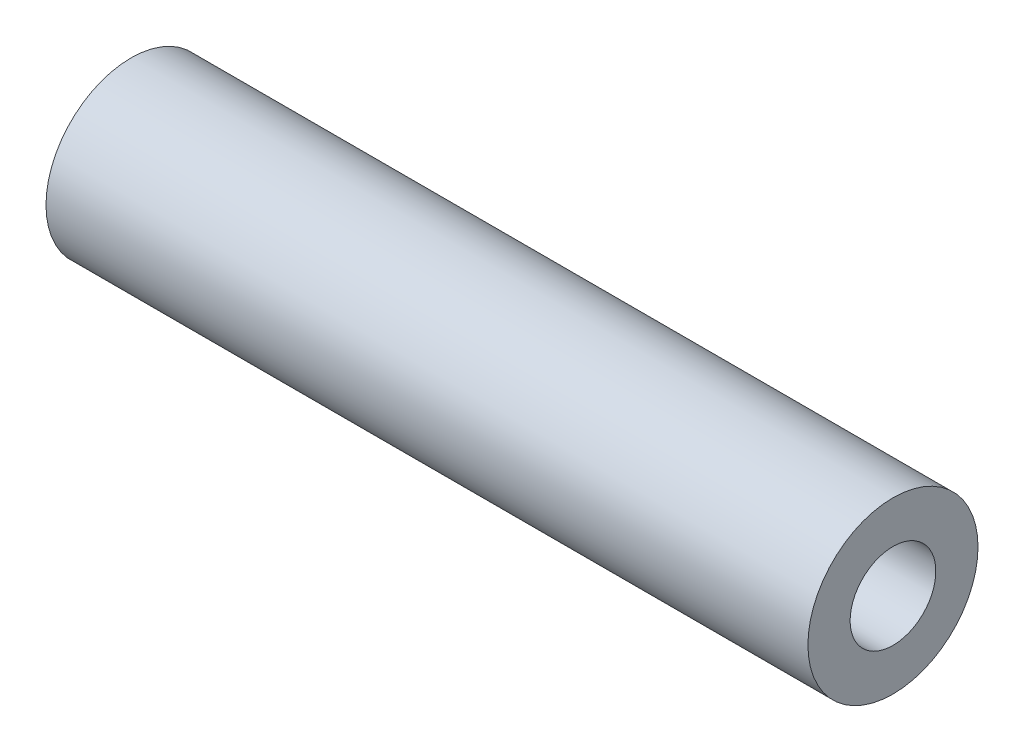
ISO-10303-21;
HEADER;
FILE_DESCRIPTION(('STEP AP214'),'2;1');
FILE_NAME('part.step','',(''),(''),'','','');
FILE_SCHEMA(('AUTOMOTIVE_DESIGN { 1 0 10303 214 1 1 1 1 }'));
ENDSEC;
DATA;
#1=APPLICATION_CONTEXT('core data for automotive mechanical design processes');
#2=APPLICATION_PROTOCOL_DEFINITION('international standard','automotive_design',2000,#1);
#3=PRODUCT_CONTEXT('',#1,'mechanical');
#4=PRODUCT('Part','Part','',(#3));
#5=PRODUCT_RELATED_PRODUCT_CATEGORY('part','',(#4));
#6=PRODUCT_DEFINITION_FORMATION('','',#4);
#7=PRODUCT_DEFINITION_CONTEXT('part definition',#1,'design');
#8=PRODUCT_DEFINITION('design','',#6,#7);
#9=PRODUCT_DEFINITION_SHAPE('','',#8);
#10=(LENGTH_UNIT() NAMED_UNIT(*) SI_UNIT(.MILLI.,.METRE.));
#11=(NAMED_UNIT(*) PLANE_ANGLE_UNIT() SI_UNIT($,.RADIAN.));
#12=(NAMED_UNIT(*) SI_UNIT($,.STERADIAN.) SOLID_ANGLE_UNIT());
#13=UNCERTAINTY_MEASURE_WITH_UNIT(LENGTH_MEASURE(1.E-05),#10,'distance_accuracy_value','');
#14=(GEOMETRIC_REPRESENTATION_CONTEXT(3) GLOBAL_UNCERTAINTY_ASSIGNED_CONTEXT((#13)) GLOBAL_UNIT_ASSIGNED_CONTEXT((#10,
#11,#12)) REPRESENTATION_CONTEXT('',''));
#15=CARTESIAN_POINT('',(0.,0.,0.));
#16=DIRECTION('',(0.,0.,1.));
#17=DIRECTION('',(1.,0.,0.));
#18=AXIS2_PLACEMENT_3D('',#15,#16,#17);
#19=CARTESIAN_POINT('',(28.448,0.,0.));
#20=DIRECTION('',(1.,0.,0.));
#21=DIRECTION('',(0.,0.,1.));
#22=AXIS2_PLACEMENT_3D('',#19,#20,#21);
#23=PLANE('',#22);
#24=CARTESIAN_POINT('',(28.448,0.,0.));
#25=DIRECTION('',(-1.,0.,0.));
#26=DIRECTION('',(0.,0.,1.));
#27=AXIS2_PLACEMENT_3D('',#24,#25,#26);
#28=CIRCLE('',#27,3.175);
#29=CARTESIAN_POINT('',(28.448,0.,3.175));
#30=VERTEX_POINT('',#29);
#31=EDGE_CURVE('E10',#30,#30,#28,.T.);
#32=ORIENTED_EDGE('',*,*,#31,.F.);
#33=EDGE_LOOP('',(#32));
#34=FACE_BOUND('',#33,.T.);
#35=CARTESIAN_POINT('',(28.448,0.,0.));
#36=DIRECTION('',(-1.,0.,0.));
#37=DIRECTION('',(0.,0.,1.));
#38=AXIS2_PLACEMENT_3D('',#35,#36,#37);
#39=CIRCLE('',#38,1.6002);
#40=CARTESIAN_POINT('',(28.448,0.,1.6002));
#41=VERTEX_POINT('',#40);
#42=EDGE_CURVE('E46',#41,#41,#39,.T.);
#43=ORIENTED_EDGE('',*,*,#42,.T.);
#44=EDGE_LOOP('',(#43));
#45=FACE_BOUND('',#44,.T.);
#46=ADVANCED_FACE('F35',(#34,#45),#23,.T.);
#47=CARTESIAN_POINT('',(0.,0.,0.));
#48=DIRECTION('',(1.,0.,0.));
#49=DIRECTION('',(0.,0.,1.));
#50=AXIS2_PLACEMENT_3D('',#47,#48,#49);
#51=PLANE('',#50);
#52=CARTESIAN_POINT('',(0.,0.,0.));
#53=DIRECTION('',(-1.,0.,0.));
#54=DIRECTION('',(0.,0.,1.));
#55=AXIS2_PLACEMENT_3D('',#52,#53,#54);
#56=CIRCLE('',#55,3.175);
#57=CARTESIAN_POINT('',(0.,0.,3.175));
#58=VERTEX_POINT('',#57);
#59=EDGE_CURVE('E39',#58,#58,#56,.T.);
#60=ORIENTED_EDGE('',*,*,#59,.T.);
#61=EDGE_LOOP('',(#60));
#62=FACE_BOUND('',#61,.T.);
#63=CARTESIAN_POINT('',(0.,0.,0.));
#64=DIRECTION('',(-1.,0.,0.));
#65=DIRECTION('',(0.,0.,1.));
#66=AXIS2_PLACEMENT_3D('',#63,#64,#65);
#67=CIRCLE('',#66,1.6002);
#68=CARTESIAN_POINT('',(0.,0.,1.6002));
#69=VERTEX_POINT('',#68);
#70=EDGE_CURVE('E48',#69,#69,#67,.T.);
#71=ORIENTED_EDGE('',*,*,#70,.F.);
#72=EDGE_LOOP('',(#71));
#73=FACE_BOUND('',#72,.T.);
#74=ADVANCED_FACE('F61',(#62,#73),#51,.F.);
#75=CARTESIAN_POINT('',(28.448,0.,0.));
#76=DIRECTION('',(-1.,0.,0.));
#77=DIRECTION('',(0.,0.,-1.));
#78=AXIS2_PLACEMENT_3D('',#75,#76,#77);
#79=CYLINDRICAL_SURFACE('',#78,3.175);
#80=ORIENTED_EDGE('',*,*,#31,.T.);
#81=EDGE_LOOP('',(#80));
#82=FACE_BOUND('',#81,.T.);
#83=ORIENTED_EDGE('',*,*,#59,.F.);
#84=EDGE_LOOP('',(#83));
#85=FACE_BOUND('',#84,.T.);
#86=ADVANCED_FACE('F37',(#82,#85),#79,.T.);
#87=CARTESIAN_POINT('',(28.448,0.,0.));
#88=DIRECTION('',(-1.,0.,0.));
#89=DIRECTION('',(0.,0.,-1.));
#90=AXIS2_PLACEMENT_3D('',#87,#88,#89);
#91=CYLINDRICAL_SURFACE('',#90,1.6002);
#92=ORIENTED_EDGE('',*,*,#42,.F.);
#93=EDGE_LOOP('',(#92));
#94=FACE_BOUND('',#93,.T.);
#95=ORIENTED_EDGE('',*,*,#70,.T.);
#96=EDGE_LOOP('',(#95));
#97=FACE_BOUND('',#96,.T.);
#98=ADVANCED_FACE('F55',(#94,#97),#91,.F.);
#99=CLOSED_SHELL('',(#46,#74,#86,#98));
#100=MANIFOLD_SOLID_BREP('B2',#99);
#101=ADVANCED_BREP_SHAPE_REPRESENTATION('',(#18,#100),#14);
#102=SHAPE_DEFINITION_REPRESENTATION(#9,#101);
ENDSEC;
END-ISO-10303-21;
